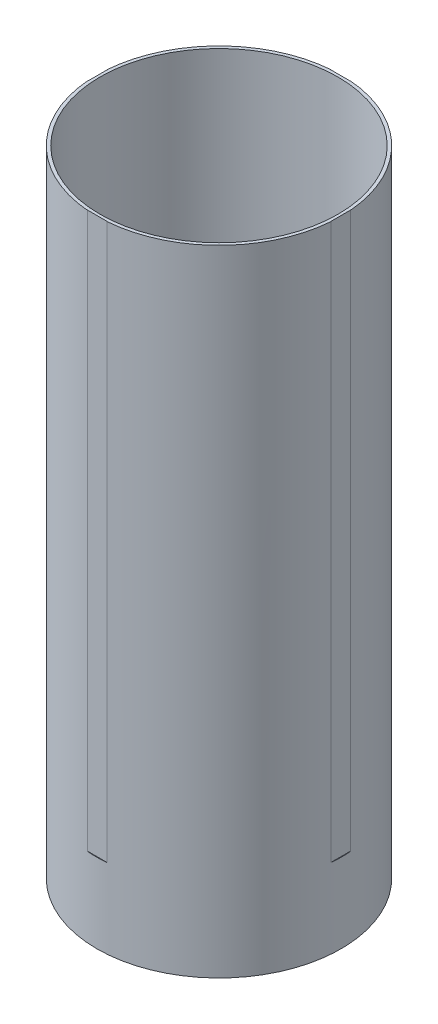
ISO-10303-21;
HEADER;
FILE_DESCRIPTION(('STEP AP214'),'2;1');
FILE_NAME('part.step','',(''),(''),'','','');
FILE_SCHEMA(('AUTOMOTIVE_DESIGN { 1 0 10303 214 1 1 1 1 }'));
ENDSEC;
DATA;
#1=APPLICATION_CONTEXT('core data for automotive mechanical design processes');
#2=APPLICATION_PROTOCOL_DEFINITION('international standard','automotive_design',2000,#1);
#3=PRODUCT_CONTEXT('',#1,'mechanical');
#4=PRODUCT('Part','Part','',(#3));
#5=PRODUCT_RELATED_PRODUCT_CATEGORY('part','',(#4));
#6=PRODUCT_DEFINITION_FORMATION('','',#4);
#7=PRODUCT_DEFINITION_CONTEXT('part definition',#1,'design');
#8=PRODUCT_DEFINITION('design','',#6,#7);
#9=PRODUCT_DEFINITION_SHAPE('','',#8);
#10=(LENGTH_UNIT() NAMED_UNIT(*) SI_UNIT(.MILLI.,.METRE.));
#11=(NAMED_UNIT(*) PLANE_ANGLE_UNIT() SI_UNIT($,.RADIAN.));
#12=(NAMED_UNIT(*) SI_UNIT($,.STERADIAN.) SOLID_ANGLE_UNIT());
#13=UNCERTAINTY_MEASURE_WITH_UNIT(LENGTH_MEASURE(1.E-05),#10,'distance_accuracy_value','');
#14=(GEOMETRIC_REPRESENTATION_CONTEXT(3) GLOBAL_UNCERTAINTY_ASSIGNED_CONTEXT((#13)) GLOBAL_UNIT_ASSIGNED_CONTEXT((#10,
#11,#12)) REPRESENTATION_CONTEXT('',''));
#15=CARTESIAN_POINT('',(0.,0.,0.));
#16=DIRECTION('',(0.,0.,1.));
#17=DIRECTION('',(1.,0.,0.));
#18=AXIS2_PLACEMENT_3D('',#15,#16,#17);
#19=CARTESIAN_POINT('',(0.,406.4,0.));
#20=DIRECTION('',(0.,1.,0.));
#21=DIRECTION('',(0.,0.,1.));
#22=AXIS2_PLACEMENT_3D('',#19,#20,#21);
#23=PLANE('',#22);
#24=DIRECTION('',(0.,0.,1.));
#25=VECTOR('',#24,1.);
#26=CARTESIAN_POINT('',(6.34999999999973,406.4,77.851));
#27=LINE('',#26,#25);
#28=CARTESIAN_POINT('',(6.34999999999973,406.4,77.851));
#29=VERTEX_POINT('',#28);
#30=CARTESIAN_POINT('',(6.34999999999973,406.4,77.9738630824458));
#31=VERTEX_POINT('',#30);
#32=EDGE_CURVE('E202',#29,#31,#27,.T.);
#33=ORIENTED_EDGE('',*,*,#32,.T.);
#34=CARTESIAN_POINT('',(0.,406.4,0.));
#35=DIRECTION('',(0.,1.,0.));
#36=DIRECTION('',(0.,0.,1.));
#37=AXIS2_PLACEMENT_3D('',#34,#35,#36);
#38=CIRCLE('',#37,78.232);
#39=CARTESIAN_POINT('',(77.9738630824458,406.4,6.34999999999994));
#40=VERTEX_POINT('',#39);
#41=EDGE_CURVE('E326',#31,#40,#38,.T.);
#42=ORIENTED_EDGE('',*,*,#41,.T.);
#43=DIRECTION('',(1.,0.,0.));
#44=VECTOR('',#43,1.);
#45=CARTESIAN_POINT('',(77.851,406.4,6.34999999999994));
#46=LINE('',#45,#44);
#47=CARTESIAN_POINT('',(77.851,406.4,6.34999999999994));
#48=VERTEX_POINT('',#47);
#49=EDGE_CURVE('E295',#48,#40,#46,.T.);
#50=ORIENTED_EDGE('',*,*,#49,.F.);
#51=DIRECTION('',(0.,0.,1.));
#52=VECTOR('',#51,1.);
#53=CARTESIAN_POINT('',(77.851,406.4,6.34999999999994));
#54=LINE('',#53,#52);
#55=CARTESIAN_POINT('',(77.851,406.4,-6.35));
#56=VERTEX_POINT('',#55);
#57=EDGE_CURVE('E209',#56,#48,#54,.T.);
#58=ORIENTED_EDGE('',*,*,#57,.F.);
#59=DIRECTION('',(1.,0.,0.));
#60=VECTOR('',#59,1.);
#61=CARTESIAN_POINT('',(77.851,406.4,-6.35));
#62=LINE('',#61,#60);
#63=CARTESIAN_POINT('',(77.9738630824457,406.4,-6.35));
#64=VERTEX_POINT('',#63);
#65=EDGE_CURVE('E296',#56,#64,#62,.T.);
#66=ORIENTED_EDGE('',*,*,#65,.T.);
#67=CARTESIAN_POINT('',(6.35000000000076,406.4,-77.9738630824457));
#68=VERTEX_POINT('',#67);
#69=EDGE_CURVE('E320',#64,#68,#38,.T.);
#70=ORIENTED_EDGE('',*,*,#69,.T.);
#71=DIRECTION('',(0.,0.,-1.));
#72=VECTOR('',#71,1.);
#73=CARTESIAN_POINT('',(6.35000000000076,406.4,-77.8509999999999));
#74=LINE('',#73,#72);
#75=CARTESIAN_POINT('',(6.35000000000076,406.4,-77.8509999999999));
#76=VERTEX_POINT('',#75);
#77=EDGE_CURVE('E259',#76,#68,#74,.T.);
#78=ORIENTED_EDGE('',*,*,#77,.F.);
#79=DIRECTION('',(1.,0.,0.));
#80=VECTOR('',#79,1.);
#81=CARTESIAN_POINT('',(6.35000000000076,406.4,-77.8509999999999));
#82=LINE('',#81,#80);
#83=CARTESIAN_POINT('',(-6.34999999999918,406.4,-77.8510000000001));
#84=VERTEX_POINT('',#83);
#85=EDGE_CURVE('E244',#84,#76,#82,.T.);
#86=ORIENTED_EDGE('',*,*,#85,.F.);
#87=DIRECTION('',(0.,0.,-1.));
#88=VECTOR('',#87,1.);
#89=CARTESIAN_POINT('',(-6.34999999999918,406.4,-77.8510000000001));
#90=LINE('',#89,#88);
#91=CARTESIAN_POINT('',(-6.34999999999918,406.4,-77.9738630824458));
#92=VERTEX_POINT('',#91);
#93=EDGE_CURVE('E273',#84,#92,#90,.T.);
#94=ORIENTED_EDGE('',*,*,#93,.T.);
#95=CARTESIAN_POINT('',(-77.9738630824458,406.4,-6.34999999999994));
#96=VERTEX_POINT('',#95);
#97=EDGE_CURVE('E325',#92,#96,#38,.T.);
#98=ORIENTED_EDGE('',*,*,#97,.T.);
#99=DIRECTION('',(-1.,0.,0.));
#100=VECTOR('',#99,1.);
#101=CARTESIAN_POINT('',(-77.851,406.4,-6.34999999999994));
#102=LINE('',#101,#100);
#103=CARTESIAN_POINT('',(-77.851,406.4,-6.34999999999994));
#104=VERTEX_POINT('',#103);
#105=EDGE_CURVE('E70',#104,#96,#102,.T.);
#106=ORIENTED_EDGE('',*,*,#105,.F.);
#107=DIRECTION('',(0.,0.,-1.));
#108=VECTOR('',#107,1.);
#109=CARTESIAN_POINT('',(-77.851,406.4,-6.34999999999994));
#110=LINE('',#109,#108);
#111=CARTESIAN_POINT('',(-77.851,406.4,6.35));
#112=VERTEX_POINT('',#111);
#113=EDGE_CURVE('E210',#112,#104,#110,.T.);
#114=ORIENTED_EDGE('',*,*,#113,.F.);
#115=DIRECTION('',(-1.,0.,0.));
#116=VECTOR('',#115,1.);
#117=CARTESIAN_POINT('',(-77.851,406.4,6.35));
#118=LINE('',#117,#116);
#119=CARTESIAN_POINT('',(-77.9738630824457,406.4,6.35));
#120=VERTEX_POINT('',#119);
#121=EDGE_CURVE('E238',#112,#120,#118,.T.);
#122=ORIENTED_EDGE('',*,*,#121,.T.);
#123=CARTESIAN_POINT('',(-6.35000000000021,406.4,77.9738630824457));
#124=VERTEX_POINT('',#123);
#125=EDGE_CURVE('E185',#120,#124,#38,.T.);
#126=ORIENTED_EDGE('',*,*,#125,.T.);
#127=DIRECTION('',(0.,0.,1.));
#128=VECTOR('',#127,1.);
#129=CARTESIAN_POINT('',(-6.35000000000021,406.4,77.851));
#130=LINE('',#129,#128);
#131=CARTESIAN_POINT('',(-6.35000000000021,406.4,77.851));
#132=VERTEX_POINT('',#131);
#133=EDGE_CURVE('E62',#132,#124,#130,.T.);
#134=ORIENTED_EDGE('',*,*,#133,.F.);
#135=DIRECTION('',(-1.,0.,0.));
#136=VECTOR('',#135,1.);
#137=CARTESIAN_POINT('',(-6.35000000000021,406.4,77.851));
#138=LINE('',#137,#136);
#139=EDGE_CURVE('E163',#29,#132,#138,.T.);
#140=ORIENTED_EDGE('',*,*,#139,.F.);
#141=EDGE_LOOP('',(#33,#42,#50,#58,#66,#70,#78,#86,#94,#98,#106,#114,#122,#126,#134,#140));
#142=FACE_BOUND('',#141,.T.);
#143=CARTESIAN_POINT('',(0.,406.4,0.));
#144=DIRECTION('',(0.,1.,0.));
#145=DIRECTION('',(0.,0.,1.));
#146=AXIS2_PLACEMENT_3D('',#143,#144,#145);
#147=CIRCLE('',#146,76.2);
#148=CARTESIAN_POINT('',(0.,406.4,76.2));
#149=VERTEX_POINT('',#148);
#150=EDGE_CURVE('E312',#149,#149,#147,.T.);
#151=ORIENTED_EDGE('',*,*,#150,.F.);
#152=EDGE_LOOP('',(#151));
#153=FACE_BOUND('',#152,.T.);
#154=ADVANCED_FACE('F46',(#142,#153),#23,.T.);
#155=CARTESIAN_POINT('',(0.,0.,0.));
#156=DIRECTION('',(0.,1.,0.));
#157=DIRECTION('',(0.,0.,1.));
#158=AXIS2_PLACEMENT_3D('',#155,#156,#157);
#159=PLANE('',#158);
#160=CARTESIAN_POINT('',(0.,0.,0.));
#161=DIRECTION('',(0.,1.,0.));
#162=DIRECTION('',(0.,0.,1.));
#163=AXIS2_PLACEMENT_3D('',#160,#161,#162);
#164=CIRCLE('',#163,78.232);
#165=CARTESIAN_POINT('',(0.,0.,78.232));
#166=VERTEX_POINT('',#165);
#167=EDGE_CURVE('E316',#166,#166,#164,.T.);
#168=ORIENTED_EDGE('',*,*,#167,.F.);
#169=EDGE_LOOP('',(#168));
#170=FACE_BOUND('',#169,.T.);
#171=CARTESIAN_POINT('',(0.,0.,0.));
#172=DIRECTION('',(0.,1.,0.));
#173=DIRECTION('',(0.,0.,1.));
#174=AXIS2_PLACEMENT_3D('',#171,#172,#173);
#175=CIRCLE('',#174,76.2);
#176=CARTESIAN_POINT('',(0.,0.,76.2));
#177=VERTEX_POINT('',#176);
#178=EDGE_CURVE('E300',#177,#177,#175,.T.);
#179=ORIENTED_EDGE('',*,*,#178,.T.);
#180=EDGE_LOOP('',(#179));
#181=FACE_BOUND('',#180,.T.);
#182=ADVANCED_FACE('F386',(#170,#181),#159,.F.);
#183=CARTESIAN_POINT('',(0.,406.4,0.));
#184=DIRECTION('',(0.,-1.,0.));
#185=DIRECTION('',(0.,0.,-1.));
#186=AXIS2_PLACEMENT_3D('',#183,#184,#185);
#187=CYLINDRICAL_SURFACE('',#186,78.232);
#188=ORIENTED_EDGE('',*,*,#41,.F.);
#189=DIRECTION('',(0.,-1.,0.));
#190=VECTOR('',#189,1.);
#191=CARTESIAN_POINT('',(6.34999999999973,406.4,77.9738630824458));
#192=LINE('',#191,#190);
#193=CARTESIAN_POINT('',(6.34999999999977,50.8,77.9738630824458));
#194=VERTEX_POINT('',#193);
#195=EDGE_CURVE('E205',#31,#194,#192,.T.);
#196=ORIENTED_EDGE('',*,*,#195,.T.);
#197=CARTESIAN_POINT('',(0.,50.8,0.));
#198=DIRECTION('',(0.,-1.,0.));
#199=DIRECTION('',(1.,0.,0.));
#200=AXIS2_PLACEMENT_3D('',#197,#198,#199);
#201=CIRCLE('',#200,78.232);
#202=CARTESIAN_POINT('',(-6.35000000000023,50.8,77.9738630824457));
#203=VERTEX_POINT('',#202);
#204=EDGE_CURVE('E198',#194,#203,#201,.T.);
#205=ORIENTED_EDGE('',*,*,#204,.T.);
#206=DIRECTION('',(0.,-1.,0.));
#207=VECTOR('',#206,1.);
#208=CARTESIAN_POINT('',(-6.35000000000021,406.4,77.9738630824457));
#209=LINE('',#208,#207);
#210=EDGE_CURVE('E187',#203,#124,#209,.F.);
#211=ORIENTED_EDGE('',*,*,#210,.T.);
#212=ORIENTED_EDGE('',*,*,#125,.F.);
#213=DIRECTION('',(0.,-1.,0.));
#214=VECTOR('',#213,1.);
#215=CARTESIAN_POINT('',(-77.9738630824457,406.4,6.35));
#216=LINE('',#215,#214);
#217=CARTESIAN_POINT('',(-77.9738630824457,50.8,6.35000000000004));
#218=VERTEX_POINT('',#217);
#219=EDGE_CURVE('E173',#120,#218,#216,.T.);
#220=ORIENTED_EDGE('',*,*,#219,.T.);
#221=CARTESIAN_POINT('',(0.,50.8,0.));
#222=DIRECTION('',(0.,-1.,0.));
#223=DIRECTION('',(0.,0.,1.));
#224=AXIS2_PLACEMENT_3D('',#221,#222,#223);
#225=CIRCLE('',#224,78.232);
#226=CARTESIAN_POINT('',(-77.9738630824458,50.8,-6.34999999999996));
#227=VERTEX_POINT('',#226);
#228=EDGE_CURVE('E234',#218,#227,#225,.T.);
#229=ORIENTED_EDGE('',*,*,#228,.T.);
#230=DIRECTION('',(0.,-1.,0.));
#231=VECTOR('',#230,1.);
#232=CARTESIAN_POINT('',(-77.9738630824458,406.4,-6.34999999999994));
#233=LINE('',#232,#231);
#234=EDGE_CURVE('E228',#227,#96,#233,.F.);
#235=ORIENTED_EDGE('',*,*,#234,.T.);
#236=ORIENTED_EDGE('',*,*,#97,.F.);
#237=DIRECTION('',(0.,-1.,0.));
#238=VECTOR('',#237,1.);
#239=CARTESIAN_POINT('',(-6.34999999999918,406.4,-77.9738630824458));
#240=LINE('',#239,#238);
#241=CARTESIAN_POINT('',(-6.34999999999922,50.8,-77.9738630824458));
#242=VERTEX_POINT('',#241);
#243=EDGE_CURVE('E214',#92,#242,#240,.T.);
#244=ORIENTED_EDGE('',*,*,#243,.T.);
#245=CARTESIAN_POINT('',(0.,50.8,0.));
#246=DIRECTION('',(0.,-1.,0.));
#247=DIRECTION('',(-1.,0.,0.));
#248=AXIS2_PLACEMENT_3D('',#245,#246,#247);
#249=CIRCLE('',#248,78.232);
#250=CARTESIAN_POINT('',(6.35000000000077,50.8,-77.9738630824457));
#251=VERTEX_POINT('',#250);
#252=EDGE_CURVE('E269',#242,#251,#249,.T.);
#253=ORIENTED_EDGE('',*,*,#252,.T.);
#254=DIRECTION('',(0.,-1.,0.));
#255=VECTOR('',#254,1.);
#256=CARTESIAN_POINT('',(6.35000000000076,406.4,-77.9738630824457));
#257=LINE('',#256,#255);
#258=EDGE_CURVE('E262',#251,#68,#257,.F.);
#259=ORIENTED_EDGE('',*,*,#258,.T.);
#260=ORIENTED_EDGE('',*,*,#69,.F.);
#261=DIRECTION('',(0.,-1.,0.));
#262=VECTOR('',#261,1.);
#263=CARTESIAN_POINT('',(77.9738630824457,406.4,-6.35));
#264=LINE('',#263,#262);
#265=CARTESIAN_POINT('',(77.9738630824457,50.8,-6.35000000000004));
#266=VERTEX_POINT('',#265);
#267=EDGE_CURVE('E11',#64,#266,#264,.T.);
#268=ORIENTED_EDGE('',*,*,#267,.T.);
#269=CARTESIAN_POINT('',(0.,50.8,0.));
#270=DIRECTION('',(0.,-1.,0.));
#271=DIRECTION('',(0.,0.,-1.));
#272=AXIS2_PLACEMENT_3D('',#269,#270,#271);
#273=CIRCLE('',#272,78.232);
#274=CARTESIAN_POINT('',(77.9738630824458,50.8,6.34999999999996));
#275=VERTEX_POINT('',#274);
#276=EDGE_CURVE('E324',#266,#275,#273,.T.);
#277=ORIENTED_EDGE('',*,*,#276,.T.);
#278=DIRECTION('',(0.,-1.,0.));
#279=VECTOR('',#278,1.);
#280=CARTESIAN_POINT('',(77.9738630824458,406.4,6.34999999999994));
#281=LINE('',#280,#279);
#282=EDGE_CURVE('E55',#275,#40,#281,.F.);
#283=ORIENTED_EDGE('',*,*,#282,.T.);
#284=EDGE_LOOP('',(#188,#196,#205,#211,#212,#220,#229,#235,#236,#244,#253,#259,#260,#268,#277,#283));
#285=FACE_BOUND('',#284,.T.);
#286=ORIENTED_EDGE('',*,*,#167,.T.);
#287=EDGE_LOOP('',(#286));
#288=FACE_BOUND('',#287,.T.);
#289=ADVANCED_FACE('F48',(#285,#288),#187,.T.);
#290=CARTESIAN_POINT('',(0.,406.4,0.));
#291=DIRECTION('',(0.,-1.,0.));
#292=DIRECTION('',(0.,0.,-1.));
#293=AXIS2_PLACEMENT_3D('',#290,#291,#292);
#294=CYLINDRICAL_SURFACE('',#293,76.2);
#295=ORIENTED_EDGE('',*,*,#150,.T.);
#296=EDGE_LOOP('',(#295));
#297=FACE_BOUND('',#296,.T.);
#298=ORIENTED_EDGE('',*,*,#178,.F.);
#299=EDGE_LOOP('',(#298));
#300=FACE_BOUND('',#299,.T.);
#301=ADVANCED_FACE('F395',(#297,#300),#294,.F.);
#302=CARTESIAN_POINT('',(77.851,406.4,-6.35));
#303=DIRECTION('',(0.,0.,-1.));
#304=DIRECTION('',(0.,1.,0.));
#305=AXIS2_PLACEMENT_3D('',#302,#303,#304);
#306=PLANE('',#305);
#307=ORIENTED_EDGE('',*,*,#65,.F.);
#308=DIRECTION('',(0.,1.,0.));
#309=VECTOR('',#308,1.);
#310=CARTESIAN_POINT('',(77.851,406.4,-6.35));
#311=LINE('',#310,#309);
#312=CARTESIAN_POINT('',(77.851,50.8,-6.35000000000004));
#313=VERTEX_POINT('',#312);
#314=EDGE_CURVE('E291',#313,#56,#311,.T.);
#315=ORIENTED_EDGE('',*,*,#314,.F.);
#316=DIRECTION('',(1.,0.,0.));
#317=VECTOR('',#316,1.);
#318=CARTESIAN_POINT('',(77.851,50.8,-6.35000000000004));
#319=LINE('',#318,#317);
#320=EDGE_CURVE('E301',#313,#266,#319,.T.);
#321=ORIENTED_EDGE('',*,*,#320,.T.);
#322=ORIENTED_EDGE('',*,*,#267,.F.);
#323=EDGE_LOOP('',(#307,#315,#321,#322));
#324=FACE_BOUND('',#323,.T.);
#325=ADVANCED_FACE('F398',(#324),#306,.F.);
#326=CARTESIAN_POINT('',(77.851,50.8,-6.35000000000004));
#327=DIRECTION('',(0.,-1.,0.));
#328=DIRECTION('',(0.,0.,-1.));
#329=AXIS2_PLACEMENT_3D('',#326,#327,#328);
#330=PLANE('',#329);
#331=ORIENTED_EDGE('',*,*,#320,.F.);
#332=DIRECTION('',(0.,0.,-1.));
#333=VECTOR('',#332,1.);
#334=CARTESIAN_POINT('',(77.851,50.8,-6.35000000000004));
#335=LINE('',#334,#333);
#336=CARTESIAN_POINT('',(77.851,50.8,6.34999999999996));
#337=VERTEX_POINT('',#336);
#338=EDGE_CURVE('E287',#337,#313,#335,.T.);
#339=ORIENTED_EDGE('',*,*,#338,.F.);
#340=DIRECTION('',(1.,0.,0.));
#341=VECTOR('',#340,1.);
#342=CARTESIAN_POINT('',(77.851,50.8,6.34999999999996));
#343=LINE('',#342,#341);
#344=EDGE_CURVE('E305',#337,#275,#343,.T.);
#345=ORIENTED_EDGE('',*,*,#344,.T.);
#346=ORIENTED_EDGE('',*,*,#276,.F.);
#347=EDGE_LOOP('',(#331,#339,#345,#346));
#348=FACE_BOUND('',#347,.T.);
#349=ADVANCED_FACE('F342',(#348),#330,.F.);
#350=CARTESIAN_POINT('',(77.851,50.8,6.34999999999996));
#351=DIRECTION('',(0.,0.,1.));
#352=DIRECTION('',(0.,-1.,0.));
#353=AXIS2_PLACEMENT_3D('',#350,#351,#352);
#354=PLANE('',#353);
#355=ORIENTED_EDGE('',*,*,#344,.F.);
#356=DIRECTION('',(0.,-1.,0.));
#357=VECTOR('',#356,1.);
#358=CARTESIAN_POINT('',(77.851,50.8,6.34999999999996));
#359=LINE('',#358,#357);
#360=EDGE_CURVE('E283',#48,#337,#359,.T.);
#361=ORIENTED_EDGE('',*,*,#360,.F.);
#362=ORIENTED_EDGE('',*,*,#49,.T.);
#363=ORIENTED_EDGE('',*,*,#282,.F.);
#364=EDGE_LOOP('',(#355,#361,#362,#363));
#365=FACE_BOUND('',#364,.T.);
#366=ADVANCED_FACE('F338',(#365),#354,.F.);
#367=CARTESIAN_POINT('',(77.851,0.,0.));
#368=DIRECTION('',(-1.,0.,0.));
#369=DIRECTION('',(0.,0.,1.));
#370=AXIS2_PLACEMENT_3D('',#367,#368,#369);
#371=PLANE('',#370);
#372=ORIENTED_EDGE('',*,*,#57,.T.);
#373=ORIENTED_EDGE('',*,*,#360,.T.);
#374=ORIENTED_EDGE('',*,*,#338,.T.);
#375=ORIENTED_EDGE('',*,*,#314,.T.);
#376=EDGE_LOOP('',(#372,#373,#374,#375));
#377=FACE_BOUND('',#376,.T.);
#378=ADVANCED_FACE('F345',(#377),#371,.F.);
#379=CARTESIAN_POINT('',(-6.34999999999918,406.4,-77.8510000000001));
#380=DIRECTION('',(-1.,0.,0.));
#381=DIRECTION('',(0.,1.,0.));
#382=AXIS2_PLACEMENT_3D('',#379,#380,#381);
#383=PLANE('',#382);
#384=ORIENTED_EDGE('',*,*,#93,.F.);
#385=DIRECTION('',(0.,1.,0.));
#386=VECTOR('',#385,1.);
#387=CARTESIAN_POINT('',(-6.34999999999918,406.4,-77.8510000000001));
#388=LINE('',#387,#386);
#389=CARTESIAN_POINT('',(-6.34999999999923,50.8,-77.8510000000001));
#390=VERTEX_POINT('',#389);
#391=EDGE_CURVE('E253',#390,#84,#388,.T.);
#392=ORIENTED_EDGE('',*,*,#391,.F.);
#393=DIRECTION('',(0.,0.,-1.));
#394=VECTOR('',#393,1.);
#395=CARTESIAN_POINT('',(-6.34999999999923,50.8,-77.8510000000001));
#396=LINE('',#395,#394);
#397=EDGE_CURVE('E266',#390,#242,#396,.T.);
#398=ORIENTED_EDGE('',*,*,#397,.T.);
#399=ORIENTED_EDGE('',*,*,#243,.F.);
#400=EDGE_LOOP('',(#384,#392,#398,#399));
#401=FACE_BOUND('',#400,.T.);
#402=ADVANCED_FACE('F408',(#401),#383,.F.);
#403=CARTESIAN_POINT('',(-6.34999999999923,50.8,-77.8510000000001));
#404=DIRECTION('',(0.,-1.,0.));
#405=DIRECTION('',(-1.,0.,0.));
#406=AXIS2_PLACEMENT_3D('',#403,#404,#405);
#407=PLANE('',#406);
#408=ORIENTED_EDGE('',*,*,#397,.F.);
#409=DIRECTION('',(-1.,0.,0.));
#410=VECTOR('',#409,1.);
#411=CARTESIAN_POINT('',(-6.34999999999923,50.8,-77.8510000000001));
#412=LINE('',#411,#410);
#413=CARTESIAN_POINT('',(6.35000000000077,50.8,-77.8509999999999));
#414=VERTEX_POINT('',#413);
#415=EDGE_CURVE('E250',#414,#390,#412,.T.);
#416=ORIENTED_EDGE('',*,*,#415,.F.);
#417=DIRECTION('',(0.,0.,-1.));
#418=VECTOR('',#417,1.);
#419=CARTESIAN_POINT('',(6.35000000000077,50.8,-77.8509999999999));
#420=LINE('',#419,#418);
#421=EDGE_CURVE('E256',#414,#251,#420,.T.);
#422=ORIENTED_EDGE('',*,*,#421,.T.);
#423=ORIENTED_EDGE('',*,*,#252,.F.);
#424=EDGE_LOOP('',(#408,#416,#422,#423));
#425=FACE_BOUND('',#424,.T.);
#426=ADVANCED_FACE('F411',(#425),#407,.F.);
#427=CARTESIAN_POINT('',(6.35000000000077,50.8,-77.8509999999999));
#428=DIRECTION('',(1.,0.,0.));
#429=DIRECTION('',(0.,-1.,0.));
#430=AXIS2_PLACEMENT_3D('',#427,#428,#429);
#431=PLANE('',#430);
#432=ORIENTED_EDGE('',*,*,#421,.F.);
#433=DIRECTION('',(0.,-1.,0.));
#434=VECTOR('',#433,1.);
#435=CARTESIAN_POINT('',(6.35000000000077,50.8,-77.8509999999999));
#436=LINE('',#435,#434);
#437=EDGE_CURVE('E247',#76,#414,#436,.T.);
#438=ORIENTED_EDGE('',*,*,#437,.F.);
#439=ORIENTED_EDGE('',*,*,#77,.T.);
#440=ORIENTED_EDGE('',*,*,#258,.F.);
#441=EDGE_LOOP('',(#432,#438,#439,#440));
#442=FACE_BOUND('',#441,.T.);
#443=ADVANCED_FACE('F415',(#442),#431,.F.);
#444=CARTESIAN_POINT('',(8.1544594113083E-13,0.,-77.851));
#445=DIRECTION('',(0.,0.,1.));
#446=DIRECTION('',(1.,0.,0.));
#447=AXIS2_PLACEMENT_3D('',#444,#445,#446);
#448=PLANE('',#447);
#449=ORIENTED_EDGE('',*,*,#85,.T.);
#450=ORIENTED_EDGE('',*,*,#437,.T.);
#451=ORIENTED_EDGE('',*,*,#415,.T.);
#452=ORIENTED_EDGE('',*,*,#391,.T.);
#453=EDGE_LOOP('',(#449,#450,#451,#452));
#454=FACE_BOUND('',#453,.T.);
#455=ADVANCED_FACE('F419',(#454),#448,.F.);
#456=CARTESIAN_POINT('',(-77.851,406.4,6.35));
#457=DIRECTION('',(0.,0.,1.));
#458=DIRECTION('',(0.,1.,0.));
#459=AXIS2_PLACEMENT_3D('',#456,#457,#458);
#460=PLANE('',#459);
#461=ORIENTED_EDGE('',*,*,#121,.F.);
#462=DIRECTION('',(0.,1.,0.));
#463=VECTOR('',#462,1.);
#464=CARTESIAN_POINT('',(-77.851,406.4,6.35));
#465=LINE('',#464,#463);
#466=CARTESIAN_POINT('',(-77.851,50.8,6.35000000000004));
#467=VERTEX_POINT('',#466);
#468=EDGE_CURVE('E220',#467,#112,#465,.T.);
#469=ORIENTED_EDGE('',*,*,#468,.F.);
#470=DIRECTION('',(-1.,0.,0.));
#471=VECTOR('',#470,1.);
#472=CARTESIAN_POINT('',(-77.851,50.8,6.35000000000004));
#473=LINE('',#472,#471);
#474=EDGE_CURVE('E231',#467,#218,#473,.T.);
#475=ORIENTED_EDGE('',*,*,#474,.T.);
#476=ORIENTED_EDGE('',*,*,#219,.F.);
#477=EDGE_LOOP('',(#461,#469,#475,#476));
#478=FACE_BOUND('',#477,.T.);
#479=ADVANCED_FACE('F367',(#478),#460,.F.);
#480=CARTESIAN_POINT('',(-77.851,50.8,6.35000000000004));
#481=DIRECTION('',(0.,-1.,0.));
#482=DIRECTION('',(0.,0.,1.));
#483=AXIS2_PLACEMENT_3D('',#480,#481,#482);
#484=PLANE('',#483);
#485=ORIENTED_EDGE('',*,*,#474,.F.);
#486=DIRECTION('',(0.,0.,1.));
#487=VECTOR('',#486,1.);
#488=CARTESIAN_POINT('',(-77.851,50.8,6.35000000000004));
#489=LINE('',#488,#487);
#490=CARTESIAN_POINT('',(-77.851,50.8,-6.34999999999996));
#491=VERTEX_POINT('',#490);
#492=EDGE_CURVE('E217',#491,#467,#489,.T.);
#493=ORIENTED_EDGE('',*,*,#492,.F.);
#494=DIRECTION('',(-1.,0.,0.));
#495=VECTOR('',#494,1.);
#496=CARTESIAN_POINT('',(-77.851,50.8,-6.34999999999996));
#497=LINE('',#496,#495);
#498=EDGE_CURVE('E223',#491,#227,#497,.T.);
#499=ORIENTED_EDGE('',*,*,#498,.T.);
#500=ORIENTED_EDGE('',*,*,#228,.F.);
#501=EDGE_LOOP('',(#485,#493,#499,#500));
#502=FACE_BOUND('',#501,.T.);
#503=ADVANCED_FACE('F361',(#502),#484,.F.);
#504=CARTESIAN_POINT('',(-77.851,50.8,-6.34999999999996));
#505=DIRECTION('',(0.,0.,-1.));
#506=DIRECTION('',(0.,-1.,0.));
#507=AXIS2_PLACEMENT_3D('',#504,#505,#506);
#508=PLANE('',#507);
#509=ORIENTED_EDGE('',*,*,#498,.F.);
#510=DIRECTION('',(0.,-1.,0.));
#511=VECTOR('',#510,1.);
#512=CARTESIAN_POINT('',(-77.851,50.8,-6.34999999999996));
#513=LINE('',#512,#511);
#514=EDGE_CURVE('E213',#104,#491,#513,.T.);
#515=ORIENTED_EDGE('',*,*,#514,.F.);
#516=ORIENTED_EDGE('',*,*,#105,.T.);
#517=ORIENTED_EDGE('',*,*,#234,.F.);
#518=EDGE_LOOP('',(#509,#515,#516,#517));
#519=FACE_BOUND('',#518,.T.);
#520=ADVANCED_FACE('F357',(#519),#508,.F.);
#521=CARTESIAN_POINT('',(-77.851,0.,0.));
#522=DIRECTION('',(1.,0.,0.));
#523=DIRECTION('',(0.,0.,-1.));
#524=AXIS2_PLACEMENT_3D('',#521,#522,#523);
#525=PLANE('',#524);
#526=ORIENTED_EDGE('',*,*,#113,.T.);
#527=ORIENTED_EDGE('',*,*,#514,.T.);
#528=ORIENTED_EDGE('',*,*,#492,.T.);
#529=ORIENTED_EDGE('',*,*,#468,.T.);
#530=EDGE_LOOP('',(#526,#527,#528,#529));
#531=FACE_BOUND('',#530,.T.);
#532=ADVANCED_FACE('F364',(#531),#525,.F.);
#533=CARTESIAN_POINT('',(6.34999999999973,406.4,77.851));
#534=DIRECTION('',(1.,0.,0.));
#535=DIRECTION('',(0.,1.,0.));
#536=AXIS2_PLACEMENT_3D('',#533,#534,#535);
#537=PLANE('',#536);
#538=ORIENTED_EDGE('',*,*,#32,.F.);
#539=DIRECTION('',(0.,1.,0.));
#540=VECTOR('',#539,1.);
#541=CARTESIAN_POINT('',(6.34999999999973,406.4,77.851));
#542=LINE('',#541,#540);
#543=CARTESIAN_POINT('',(6.34999999999977,50.8,77.851));
#544=VERTEX_POINT('',#543);
#545=EDGE_CURVE('E168',#544,#29,#542,.T.);
#546=ORIENTED_EDGE('',*,*,#545,.F.);
#547=DIRECTION('',(0.,0.,1.));
#548=VECTOR('',#547,1.);
#549=CARTESIAN_POINT('',(6.34999999999977,50.8,77.851));
#550=LINE('',#549,#548);
#551=EDGE_CURVE('E191',#544,#194,#550,.T.);
#552=ORIENTED_EDGE('',*,*,#551,.T.);
#553=ORIENTED_EDGE('',*,*,#195,.F.);
#554=EDGE_LOOP('',(#538,#546,#552,#553));
#555=FACE_BOUND('',#554,.T.);
#556=ADVANCED_FACE('F376',(#555),#537,.F.);
#557=CARTESIAN_POINT('',(6.34999999999977,50.8,77.851));
#558=DIRECTION('',(0.,-1.,0.));
#559=DIRECTION('',(1.,0.,0.));
#560=AXIS2_PLACEMENT_3D('',#557,#558,#559);
#561=PLANE('',#560);
#562=ORIENTED_EDGE('',*,*,#551,.F.);
#563=DIRECTION('',(1.,0.,0.));
#564=VECTOR('',#563,1.);
#565=CARTESIAN_POINT('',(6.34999999999977,50.8,77.851));
#566=LINE('',#565,#564);
#567=CARTESIAN_POINT('',(-6.35000000000023,50.8,77.851));
#568=VERTEX_POINT('',#567);
#569=EDGE_CURVE('E179',#568,#544,#566,.T.);
#570=ORIENTED_EDGE('',*,*,#569,.F.);
#571=DIRECTION('',(0.,0.,1.));
#572=VECTOR('',#571,1.);
#573=CARTESIAN_POINT('',(-6.35000000000023,50.8,77.851));
#574=LINE('',#573,#572);
#575=EDGE_CURVE('E177',#568,#203,#574,.T.);
#576=ORIENTED_EDGE('',*,*,#575,.T.);
#577=ORIENTED_EDGE('',*,*,#204,.F.);
#578=EDGE_LOOP('',(#562,#570,#576,#577));
#579=FACE_BOUND('',#578,.T.);
#580=ADVANCED_FACE('F371',(#579),#561,.F.);
#581=CARTESIAN_POINT('',(-6.35000000000023,50.8,77.851));
#582=DIRECTION('',(-1.,0.,0.));
#583=DIRECTION('',(0.,-1.,0.));
#584=AXIS2_PLACEMENT_3D('',#581,#582,#583);
#585=PLANE('',#584);
#586=ORIENTED_EDGE('',*,*,#575,.F.);
#587=DIRECTION('',(0.,-1.,0.));
#588=VECTOR('',#587,1.);
#589=CARTESIAN_POINT('',(-6.35000000000023,50.8,77.851));
#590=LINE('',#589,#588);
#591=EDGE_CURVE('E165',#132,#568,#590,.T.);
#592=ORIENTED_EDGE('',*,*,#591,.F.);
#593=ORIENTED_EDGE('',*,*,#133,.T.);
#594=ORIENTED_EDGE('',*,*,#210,.F.);
#595=EDGE_LOOP('',(#586,#592,#593,#594));
#596=FACE_BOUND('',#595,.T.);
#597=ADVANCED_FACE('F176',(#596),#585,.F.);
#598=CARTESIAN_POINT('',(-2.71815313710277E-13,0.,77.851));
#599=DIRECTION('',(0.,0.,-1.));
#600=DIRECTION('',(-1.,0.,0.));
#601=AXIS2_PLACEMENT_3D('',#598,#599,#600);
#602=PLANE('',#601);
#603=ORIENTED_EDGE('',*,*,#139,.T.);
#604=ORIENTED_EDGE('',*,*,#591,.T.);
#605=ORIENTED_EDGE('',*,*,#569,.T.);
#606=ORIENTED_EDGE('',*,*,#545,.T.);
#607=EDGE_LOOP('',(#603,#604,#605,#606));
#608=FACE_BOUND('',#607,.T.);
#609=ADVANCED_FACE('F164',(#608),#602,.F.);
#610=CLOSED_SHELL('',(#154,#182,#289,#301,#325,#349,#366,#378,#402,#426,#443,#455,#479,#503,
#520,#532,#556,#580,#597,#609));
#611=MANIFOLD_SOLID_BREP('B2',#610);
#612=ADVANCED_BREP_SHAPE_REPRESENTATION('',(#18,#611),#14);
#613=SHAPE_DEFINITION_REPRESENTATION(#9,#612);
ENDSEC;
END-ISO-10303-21;
